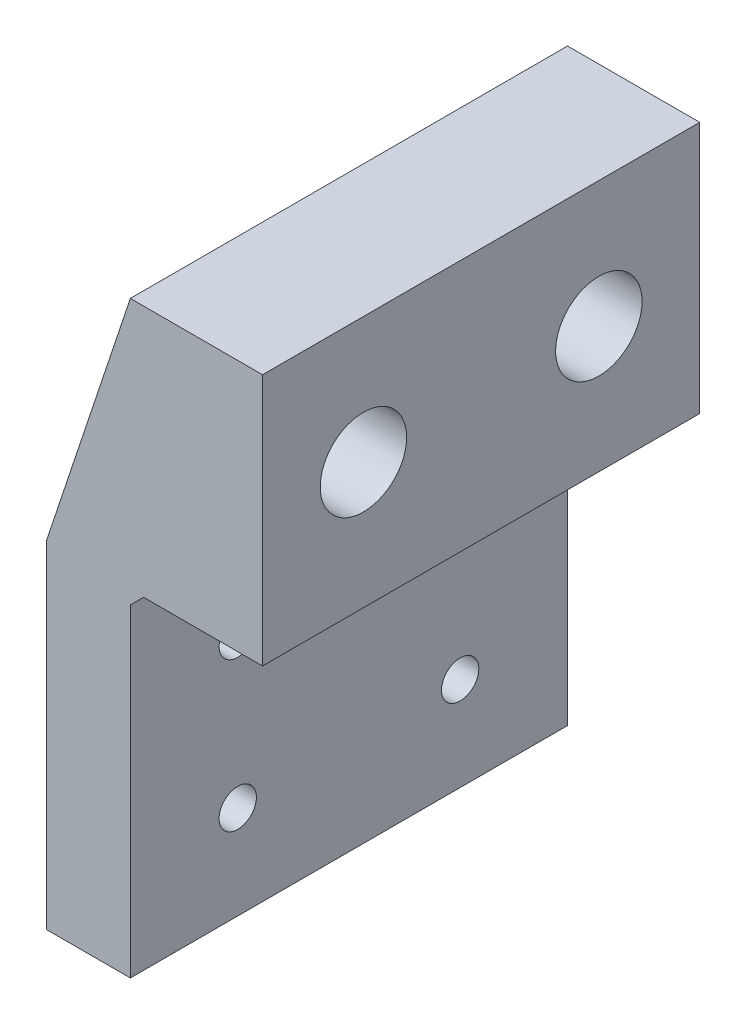
ISO-10303-21;
HEADER;
FILE_DESCRIPTION(('STEP AP214'),'2;1');
FILE_NAME('part.step','',(''),(''),'','','');
FILE_SCHEMA(('AUTOMOTIVE_DESIGN { 1 0 10303 214 1 1 1 1 }'));
ENDSEC;
DATA;
#1=APPLICATION_CONTEXT('core data for automotive mechanical design processes');
#2=APPLICATION_PROTOCOL_DEFINITION('international standard','automotive_design',2000,#1);
#3=PRODUCT_CONTEXT('',#1,'mechanical');
#4=PRODUCT('Part','Part','',(#3));
#5=PRODUCT_RELATED_PRODUCT_CATEGORY('part','',(#4));
#6=PRODUCT_DEFINITION_FORMATION('','',#4);
#7=PRODUCT_DEFINITION_CONTEXT('part definition',#1,'design');
#8=PRODUCT_DEFINITION('design','',#6,#7);
#9=PRODUCT_DEFINITION_SHAPE('','',#8);
#10=(LENGTH_UNIT() NAMED_UNIT(*) SI_UNIT(.MILLI.,.METRE.));
#11=(NAMED_UNIT(*) PLANE_ANGLE_UNIT() SI_UNIT($,.RADIAN.));
#12=(NAMED_UNIT(*) SI_UNIT($,.STERADIAN.) SOLID_ANGLE_UNIT());
#13=UNCERTAINTY_MEASURE_WITH_UNIT(LENGTH_MEASURE(1.E-05),#10,'distance_accuracy_value','');
#14=(GEOMETRIC_REPRESENTATION_CONTEXT(3) GLOBAL_UNCERTAINTY_ASSIGNED_CONTEXT((#13)) GLOBAL_UNIT_ASSIGNED_CONTEXT((#10,
#11,#12)) REPRESENTATION_CONTEXT('',''));
#15=CARTESIAN_POINT('',(0.,0.,0.));
#16=DIRECTION('',(0.,0.,1.));
#17=DIRECTION('',(1.,0.,0.));
#18=AXIS2_PLACEMENT_3D('',#15,#16,#17);
#19=CARTESIAN_POINT('',(16.333600048,9.525,-25.4));
#20=DIRECTION('',(1.,0.,0.));
#21=DIRECTION('',(0.,0.,-1.));
#22=AXIS2_PLACEMENT_3D('',#19,#20,#21);
#23=CYLINDRICAL_SURFACE('',#22,3.26389999999999);
#24=CARTESIAN_POINT('',(16.333600048,9.525,-25.4));
#25=DIRECTION('',(1.,0.,0.));
#26=DIRECTION('',(0.,0.,-1.));
#27=AXIS2_PLACEMENT_3D('',#24,#25,#26);
#28=CIRCLE('',#27,3.26389999999999);
#29=CARTESIAN_POINT('',(16.333600048,9.525,-28.6639));
#30=VERTEX_POINT('',#29);
#31=EDGE_CURVE('E173',#30,#30,#28,.T.);
#32=ORIENTED_EDGE('',*,*,#31,.T.);
#33=EDGE_LOOP('',(#32));
#34=FACE_BOUND('',#33,.T.);
#35=CARTESIAN_POINT('',(7.62,9.525,-25.4));
#36=DIRECTION('',(-1.,0.,0.));
#37=DIRECTION('',(0.,0.,1.));
#38=AXIS2_PLACEMENT_3D('',#35,#36,#37);
#39=CIRCLE('',#38,3.26389999999999);
#40=CARTESIAN_POINT('',(7.62,9.525,-22.1361));
#41=VERTEX_POINT('',#40);
#42=EDGE_CURVE('E167',#41,#41,#39,.F.);
#43=ORIENTED_EDGE('',*,*,#42,.F.);
#44=EDGE_LOOP('',(#43));
#45=FACE_BOUND('',#44,.T.);
#46=ADVANCED_FACE('F41',(#34,#45),#23,.F.);
#47=CARTESIAN_POINT('',(16.333600048,9.525,-7.62));
#48=DIRECTION('',(1.,0.,0.));
#49=DIRECTION('',(0.,0.,-1.));
#50=AXIS2_PLACEMENT_3D('',#47,#48,#49);
#51=CYLINDRICAL_SURFACE('',#50,3.26389999999999);
#52=CARTESIAN_POINT('',(16.333600048,9.525,-7.62));
#53=DIRECTION('',(1.,0.,0.));
#54=DIRECTION('',(0.,0.,-1.));
#55=AXIS2_PLACEMENT_3D('',#52,#53,#54);
#56=CIRCLE('',#55,3.26389999999999);
#57=CARTESIAN_POINT('',(16.333600048,9.525,-10.8839));
#58=VERTEX_POINT('',#57);
#59=EDGE_CURVE('E170',#58,#58,#56,.T.);
#60=ORIENTED_EDGE('',*,*,#59,.T.);
#61=EDGE_LOOP('',(#60));
#62=FACE_BOUND('',#61,.T.);
#63=CARTESIAN_POINT('',(7.62,9.525,-7.62));
#64=DIRECTION('',(-1.,0.,0.));
#65=DIRECTION('',(0.,0.,1.));
#66=AXIS2_PLACEMENT_3D('',#63,#64,#65);
#67=CIRCLE('',#66,3.26389999999999);
#68=CARTESIAN_POINT('',(7.62,9.525,-4.35610000000001));
#69=VERTEX_POINT('',#68);
#70=EDGE_CURVE('E162',#69,#69,#67,.F.);
#71=ORIENTED_EDGE('',*,*,#70,.F.);
#72=EDGE_LOOP('',(#71));
#73=FACE_BOUND('',#72,.T.);
#74=ADVANCED_FACE('F290',(#62,#73),#51,.F.);
#75=CARTESIAN_POINT('',(16.333600048,0.,0.));
#76=DIRECTION('',(-1.,0.,0.));
#77=DIRECTION('',(0.,0.,1.));
#78=AXIS2_PLACEMENT_3D('',#75,#76,#77);
#79=PLANE('',#78);
#80=ORIENTED_EDGE('',*,*,#31,.F.);
#81=EDGE_LOOP('',(#80));
#82=FACE_BOUND('',#81,.T.);
#83=DIRECTION('',(0.,-1.,0.));
#84=VECTOR('',#83,1.);
#85=CARTESIAN_POINT('',(16.333600048,0.,0.));
#86=LINE('',#85,#84);
#87=CARTESIAN_POINT('',(16.333600048,19.05,0.));
#88=VERTEX_POINT('',#87);
#89=CARTESIAN_POINT('',(16.333600048,0.,0.));
#90=VERTEX_POINT('',#89);
#91=EDGE_CURVE('E176',#88,#90,#86,.T.);
#92=ORIENTED_EDGE('',*,*,#91,.T.);
#93=DIRECTION('',(0.,0.,-1.));
#94=VECTOR('',#93,1.);
#95=CARTESIAN_POINT('',(16.333600048,0.,0.));
#96=LINE('',#95,#94);
#97=CARTESIAN_POINT('',(16.333600048,0.,-33.02));
#98=VERTEX_POINT('',#97);
#99=EDGE_CURVE('E179',#90,#98,#96,.T.);
#100=ORIENTED_EDGE('',*,*,#99,.T.);
#101=DIRECTION('',(0.,1.,0.));
#102=VECTOR('',#101,1.);
#103=CARTESIAN_POINT('',(16.333600048,0.,-33.02));
#104=LINE('',#103,#102);
#105=CARTESIAN_POINT('',(16.333600048,19.05,-33.02));
#106=VERTEX_POINT('',#105);
#107=EDGE_CURVE('E181',#98,#106,#104,.T.);
#108=ORIENTED_EDGE('',*,*,#107,.T.);
#109=DIRECTION('',(0.,0.,1.));
#110=VECTOR('',#109,1.);
#111=CARTESIAN_POINT('',(16.333600048,19.05,0.));
#112=LINE('',#111,#110);
#113=EDGE_CURVE('E183',#106,#88,#112,.T.);
#114=ORIENTED_EDGE('',*,*,#113,.T.);
#115=EDGE_LOOP('',(#92,#100,#108,#114));
#116=FACE_BOUND('',#115,.T.);
#117=ORIENTED_EDGE('',*,*,#59,.F.);
#118=EDGE_LOOP('',(#117));
#119=FACE_BOUND('',#118,.T.);
#120=ADVANCED_FACE('F275',(#82,#116,#119),#79,.F.);
#121=CARTESIAN_POINT('',(6.35,0.,0.));
#122=DIRECTION('',(1.,0.,0.));
#123=DIRECTION('',(0.,0.,-1.));
#124=AXIS2_PLACEMENT_3D('',#121,#122,#123);
#125=PLANE('',#124);
#126=DIRECTION('',(0.,1.,0.));
#127=VECTOR('',#126,1.);
#128=CARTESIAN_POINT('',(6.35,0.,-33.02));
#129=LINE('',#128,#127);
#130=CARTESIAN_POINT('',(6.35,-25.4,-33.02));
#131=VERTEX_POINT('',#130);
#132=CARTESIAN_POINT('',(6.35,-0.999999999999994,-33.02));
#133=VERTEX_POINT('',#132);
#134=EDGE_CURVE('E234',#131,#133,#129,.T.);
#135=ORIENTED_EDGE('',*,*,#134,.T.);
#136=DIRECTION('',(0.,0.,1.));
#137=VECTOR('',#136,1.);
#138=CARTESIAN_POINT('',(6.35,-0.999999999999994,0.));
#139=LINE('',#138,#137);
#140=CARTESIAN_POINT('',(6.35,-0.999999999999994,0.));
#141=VERTEX_POINT('',#140);
#142=EDGE_CURVE('E63',#133,#141,#139,.T.);
#143=ORIENTED_EDGE('',*,*,#142,.T.);
#144=DIRECTION('',(0.,-1.,0.));
#145=VECTOR('',#144,1.);
#146=CARTESIAN_POINT('',(6.35,0.,0.));
#147=LINE('',#146,#145);
#148=CARTESIAN_POINT('',(6.35,-25.4,0.));
#149=VERTEX_POINT('',#148);
#150=EDGE_CURVE('E229',#141,#149,#147,.T.);
#151=ORIENTED_EDGE('',*,*,#150,.T.);
#152=DIRECTION('',(0.,0.,-1.));
#153=VECTOR('',#152,1.);
#154=CARTESIAN_POINT('',(6.35,-25.4,0.));
#155=LINE('',#154,#153);
#156=EDGE_CURVE('E231',#149,#131,#155,.T.);
#157=ORIENTED_EDGE('',*,*,#156,.T.);
#158=EDGE_LOOP('',(#135,#143,#151,#157));
#159=FACE_BOUND('',#158,.T.);
#160=CARTESIAN_POINT('',(6.35,-18.3261,-24.9089834759928));
#161=DIRECTION('',(1.,0.,0.));
#162=DIRECTION('',(0.,0.,-1.));
#163=AXIS2_PLACEMENT_3D('',#160,#161,#162);
#164=CIRCLE('',#163,1.4097);
#165=CARTESIAN_POINT('',(6.35,-18.3261,-26.3186834759928));
#166=VERTEX_POINT('',#165);
#167=EDGE_CURVE('E211',#166,#166,#164,.T.);
#168=ORIENTED_EDGE('',*,*,#167,.F.);
#169=EDGE_LOOP('',(#168));
#170=FACE_BOUND('',#169,.T.);
#171=CARTESIAN_POINT('',(6.35,-7.0739,-8.11101652400721));
#172=DIRECTION('',(1.,0.,0.));
#173=DIRECTION('',(0.,0.,-1.));
#174=AXIS2_PLACEMENT_3D('',#171,#172,#173);
#175=CIRCLE('',#174,1.4097);
#176=CARTESIAN_POINT('',(6.35,-7.0739,-9.52071652400721));
#177=VERTEX_POINT('',#176);
#178=EDGE_CURVE('E223',#177,#177,#175,.T.);
#179=ORIENTED_EDGE('',*,*,#178,.F.);
#180=EDGE_LOOP('',(#179));
#181=FACE_BOUND('',#180,.T.);
#182=CARTESIAN_POINT('',(6.35,-18.3261,-8.11101652400721));
#183=DIRECTION('',(1.,0.,0.));
#184=DIRECTION('',(0.,0.,-1.));
#185=AXIS2_PLACEMENT_3D('',#182,#183,#184);
#186=CIRCLE('',#185,1.4097);
#187=CARTESIAN_POINT('',(6.35,-18.3261,-9.52071652400721));
#188=VERTEX_POINT('',#187);
#189=EDGE_CURVE('E217',#188,#188,#186,.T.);
#190=ORIENTED_EDGE('',*,*,#189,.F.);
#191=EDGE_LOOP('',(#190));
#192=FACE_BOUND('',#191,.T.);
#193=CARTESIAN_POINT('',(6.35,-7.07389999999999,-24.9089834759928));
#194=DIRECTION('',(1.,0.,0.));
#195=DIRECTION('',(0.,0.,-1.));
#196=AXIS2_PLACEMENT_3D('',#193,#194,#195);
#197=CIRCLE('',#196,1.4097);
#198=CARTESIAN_POINT('',(6.35,-7.07389999999999,-26.3186834759928));
#199=VERTEX_POINT('',#198);
#200=EDGE_CURVE('E205',#199,#199,#197,.T.);
#201=ORIENTED_EDGE('',*,*,#200,.F.);
#202=EDGE_LOOP('',(#201));
#203=FACE_BOUND('',#202,.T.);
#204=ADVANCED_FACE('F303',(#159,#170,#181,#192,#203),#125,.T.);
#205=CARTESIAN_POINT('',(0.,0.,0.));
#206=DIRECTION('',(1.,0.,0.));
#207=DIRECTION('',(0.,0.,-1.));
#208=AXIS2_PLACEMENT_3D('',#205,#206,#207);
#209=PLANE('',#208);
#210=DIRECTION('',(0.,-1.,0.));
#211=VECTOR('',#210,1.);
#212=CARTESIAN_POINT('',(0.,0.,0.));
#213=LINE('',#212,#211);
#214=CARTESIAN_POINT('',(0.,0.,0.));
#215=VERTEX_POINT('',#214);
#216=CARTESIAN_POINT('',(0.,-25.4,0.));
#217=VERTEX_POINT('',#216);
#218=EDGE_CURVE('E226',#215,#217,#213,.T.);
#219=ORIENTED_EDGE('',*,*,#218,.F.);
#220=DIRECTION('',(0.,0.,1.));
#221=VECTOR('',#220,1.);
#222=CARTESIAN_POINT('',(0.,0.,0.));
#223=LINE('',#222,#221);
#224=CARTESIAN_POINT('',(0.,0.,-33.02));
#225=VERTEX_POINT('',#224);
#226=EDGE_CURVE('E232',#225,#215,#223,.T.);
#227=ORIENTED_EDGE('',*,*,#226,.F.);
#228=DIRECTION('',(0.,1.,0.));
#229=VECTOR('',#228,1.);
#230=CARTESIAN_POINT('',(0.,0.,-33.02));
#231=LINE('',#230,#229);
#232=CARTESIAN_POINT('',(0.,-25.4,-33.02));
#233=VERTEX_POINT('',#232);
#234=EDGE_CURVE('E241',#233,#225,#231,.T.);
#235=ORIENTED_EDGE('',*,*,#234,.F.);
#236=DIRECTION('',(0.,0.,-1.));
#237=VECTOR('',#236,1.);
#238=CARTESIAN_POINT('',(0.,-25.4,0.));
#239=LINE('',#238,#237);
#240=EDGE_CURVE('E239',#217,#233,#239,.T.);
#241=ORIENTED_EDGE('',*,*,#240,.F.);
#242=EDGE_LOOP('',(#219,#227,#235,#241));
#243=FACE_BOUND('',#242,.T.);
#244=CARTESIAN_POINT('',(0.,-7.0739,-8.11101652400721));
#245=DIRECTION('',(1.,0.,0.));
#246=DIRECTION('',(0.,0.,-1.));
#247=AXIS2_PLACEMENT_3D('',#244,#245,#246);
#248=CIRCLE('',#247,1.4097);
#249=CARTESIAN_POINT('',(0.,-7.0739,-9.52071652400721));
#250=VERTEX_POINT('',#249);
#251=EDGE_CURVE('E220',#250,#250,#248,.T.);
#252=ORIENTED_EDGE('',*,*,#251,.T.);
#253=EDGE_LOOP('',(#252));
#254=FACE_BOUND('',#253,.T.);
#255=CARTESIAN_POINT('',(0.,-18.3261,-8.11101652400721));
#256=DIRECTION('',(1.,0.,0.));
#257=DIRECTION('',(0.,0.,-1.));
#258=AXIS2_PLACEMENT_3D('',#255,#256,#257);
#259=CIRCLE('',#258,1.4097);
#260=CARTESIAN_POINT('',(0.,-18.3261,-9.52071652400721));
#261=VERTEX_POINT('',#260);
#262=EDGE_CURVE('E214',#261,#261,#259,.T.);
#263=ORIENTED_EDGE('',*,*,#262,.T.);
#264=EDGE_LOOP('',(#263));
#265=FACE_BOUND('',#264,.T.);
#266=CARTESIAN_POINT('',(0.,-18.3261,-24.9089834759928));
#267=DIRECTION('',(1.,0.,0.));
#268=DIRECTION('',(0.,0.,-1.));
#269=AXIS2_PLACEMENT_3D('',#266,#267,#268);
#270=CIRCLE('',#269,1.4097);
#271=CARTESIAN_POINT('',(0.,-18.3261,-26.3186834759928));
#272=VERTEX_POINT('',#271);
#273=EDGE_CURVE('E208',#272,#272,#270,.T.);
#274=ORIENTED_EDGE('',*,*,#273,.T.);
#275=EDGE_LOOP('',(#274));
#276=FACE_BOUND('',#275,.T.);
#277=CARTESIAN_POINT('',(0.,-7.07389999999999,-24.9089834759928));
#278=DIRECTION('',(1.,0.,0.));
#279=DIRECTION('',(0.,0.,-1.));
#280=AXIS2_PLACEMENT_3D('',#277,#278,#279);
#281=CIRCLE('',#280,1.4097);
#282=CARTESIAN_POINT('',(0.,-7.07389999999999,-26.3186834759928));
#283=VERTEX_POINT('',#282);
#284=EDGE_CURVE('E204',#283,#283,#281,.T.);
#285=ORIENTED_EDGE('',*,*,#284,.T.);
#286=EDGE_LOOP('',(#285));
#287=FACE_BOUND('',#286,.T.);
#288=ADVANCED_FACE('F332',(#243,#254,#265,#276,#287),#209,.F.);
#289=CARTESIAN_POINT('',(6.35,0.,0.));
#290=DIRECTION('',(0.,0.,-1.));
#291=DIRECTION('',(0.,1.,0.));
#292=AXIS2_PLACEMENT_3D('',#289,#290,#291);
#293=PLANE('',#292);
#294=ORIENTED_EDGE('',*,*,#218,.T.);
#295=DIRECTION('',(-1.,0.,0.));
#296=VECTOR('',#295,1.);
#297=CARTESIAN_POINT('',(6.35,-25.4,0.));
#298=LINE('',#297,#296);
#299=EDGE_CURVE('E248',#149,#217,#298,.T.);
#300=ORIENTED_EDGE('',*,*,#299,.F.);
#301=ORIENTED_EDGE('',*,*,#150,.F.);
#302=DIRECTION('',(0.70710678118655,0.707106781186545,0.));
#303=VECTOR('',#302,1.);
#304=CARTESIAN_POINT('',(6.85,-0.5,0.));
#305=LINE('',#304,#303);
#306=CARTESIAN_POINT('',(7.35,0.,0.));
#307=VERTEX_POINT('',#306);
#308=EDGE_CURVE('E11',#141,#307,#305,.T.);
#309=ORIENTED_EDGE('',*,*,#308,.T.);
#310=DIRECTION('',(-1.,0.,0.));
#311=VECTOR('',#310,1.);
#312=CARTESIAN_POINT('',(16.333600048,0.,0.));
#313=LINE('',#312,#311);
#314=EDGE_CURVE('E193',#90,#307,#313,.T.);
#315=ORIENTED_EDGE('',*,*,#314,.F.);
#316=ORIENTED_EDGE('',*,*,#91,.F.);
#317=DIRECTION('',(-1.,0.,0.));
#318=VECTOR('',#317,1.);
#319=CARTESIAN_POINT('',(16.333600048,19.05,0.));
#320=LINE('',#319,#318);
#321=CARTESIAN_POINT('',(6.35,19.05,0.));
#322=VERTEX_POINT('',#321);
#323=EDGE_CURVE('E185',#88,#322,#320,.T.);
#324=ORIENTED_EDGE('',*,*,#323,.T.);
#325=DIRECTION('',(-0.316227766016838,-0.948683298050514,0.));
#326=VECTOR('',#325,1.);
#327=CARTESIAN_POINT('',(6.35,19.05,0.));
#328=LINE('',#327,#326);
#329=EDGE_CURVE('E196',#322,#215,#328,.T.);
#330=ORIENTED_EDGE('',*,*,#329,.T.);
#331=EDGE_LOOP('',(#294,#300,#301,#309,#315,#316,#324,#330));
#332=FACE_BOUND('',#331,.T.);
#333=ADVANCED_FACE('F280',(#332),#293,.F.);
#334=CARTESIAN_POINT('',(6.35,-25.4,0.));
#335=DIRECTION('',(0.,1.,0.));
#336=DIRECTION('',(0.,0.,1.));
#337=AXIS2_PLACEMENT_3D('',#334,#335,#336);
#338=PLANE('',#337);
#339=ORIENTED_EDGE('',*,*,#240,.T.);
#340=DIRECTION('',(-1.,0.,0.));
#341=VECTOR('',#340,1.);
#342=CARTESIAN_POINT('',(6.35,-25.4,-33.02));
#343=LINE('',#342,#341);
#344=EDGE_CURVE('E236',#131,#233,#343,.T.);
#345=ORIENTED_EDGE('',*,*,#344,.F.);
#346=ORIENTED_EDGE('',*,*,#156,.F.);
#347=ORIENTED_EDGE('',*,*,#299,.T.);
#348=EDGE_LOOP('',(#339,#345,#346,#347));
#349=FACE_BOUND('',#348,.T.);
#350=ADVANCED_FACE('F338',(#349),#338,.F.);
#351=CARTESIAN_POINT('',(6.35,0.,-33.02));
#352=DIRECTION('',(0.,0.,1.));
#353=DIRECTION('',(1.,0.,0.));
#354=AXIS2_PLACEMENT_3D('',#351,#352,#353);
#355=PLANE('',#354);
#356=ORIENTED_EDGE('',*,*,#234,.T.);
#357=DIRECTION('',(0.316227766016838,0.948683298050514,0.));
#358=VECTOR('',#357,1.);
#359=CARTESIAN_POINT('',(6.35,19.05,-33.02));
#360=LINE('',#359,#358);
#361=CARTESIAN_POINT('',(6.35,19.05,-33.02));
#362=VERTEX_POINT('',#361);
#363=EDGE_CURVE('E202',#225,#362,#360,.T.);
#364=ORIENTED_EDGE('',*,*,#363,.T.);
#365=DIRECTION('',(-1.,0.,0.));
#366=VECTOR('',#365,1.);
#367=CARTESIAN_POINT('',(16.333600048,19.05,-33.02));
#368=LINE('',#367,#366);
#369=EDGE_CURVE('E188',#106,#362,#368,.T.);
#370=ORIENTED_EDGE('',*,*,#369,.F.);
#371=ORIENTED_EDGE('',*,*,#107,.F.);
#372=DIRECTION('',(-1.,0.,0.));
#373=VECTOR('',#372,1.);
#374=CARTESIAN_POINT('',(16.333600048,0.,-33.02));
#375=LINE('',#374,#373);
#376=CARTESIAN_POINT('',(7.35,0.,-33.02));
#377=VERTEX_POINT('',#376);
#378=EDGE_CURVE('E191',#98,#377,#375,.T.);
#379=ORIENTED_EDGE('',*,*,#378,.T.);
#380=DIRECTION('',(-0.70710678118655,-0.707106781186545,0.));
#381=VECTOR('',#380,1.);
#382=CARTESIAN_POINT('',(6.85,-0.5,-33.02));
#383=LINE('',#382,#381);
#384=EDGE_CURVE('E50',#377,#133,#383,.T.);
#385=ORIENTED_EDGE('',*,*,#384,.T.);
#386=ORIENTED_EDGE('',*,*,#134,.F.);
#387=ORIENTED_EDGE('',*,*,#344,.T.);
#388=EDGE_LOOP('',(#356,#364,#370,#371,#379,#385,#386,#387));
#389=FACE_BOUND('',#388,.T.);
#390=ADVANCED_FACE('F271',(#389),#355,.F.);
#391=CARTESIAN_POINT('',(6.35,-7.0739,-8.11101652400721));
#392=DIRECTION('',(-1.,0.,0.));
#393=DIRECTION('',(0.,0.,1.));
#394=AXIS2_PLACEMENT_3D('',#391,#392,#393);
#395=CYLINDRICAL_SURFACE('',#394,1.4097);
#396=ORIENTED_EDGE('',*,*,#178,.T.);
#397=EDGE_LOOP('',(#396));
#398=FACE_BOUND('',#397,.T.);
#399=ORIENTED_EDGE('',*,*,#251,.F.);
#400=EDGE_LOOP('',(#399));
#401=FACE_BOUND('',#400,.T.);
#402=ADVANCED_FACE('F325',(#398,#401),#395,.F.);
#403=CARTESIAN_POINT('',(6.35,-18.3261,-8.11101652400721));
#404=DIRECTION('',(-1.,0.,0.));
#405=DIRECTION('',(0.,0.,1.));
#406=AXIS2_PLACEMENT_3D('',#403,#404,#405);
#407=CYLINDRICAL_SURFACE('',#406,1.4097);
#408=ORIENTED_EDGE('',*,*,#189,.T.);
#409=EDGE_LOOP('',(#408));
#410=FACE_BOUND('',#409,.T.);
#411=ORIENTED_EDGE('',*,*,#262,.F.);
#412=EDGE_LOOP('',(#411));
#413=FACE_BOUND('',#412,.T.);
#414=ADVANCED_FACE('F321',(#410,#413),#407,.F.);
#415=CARTESIAN_POINT('',(6.35,-18.3261,-24.9089834759928));
#416=DIRECTION('',(-1.,0.,0.));
#417=DIRECTION('',(0.,0.,1.));
#418=AXIS2_PLACEMENT_3D('',#415,#416,#417);
#419=CYLINDRICAL_SURFACE('',#418,1.4097);
#420=ORIENTED_EDGE('',*,*,#167,.T.);
#421=EDGE_LOOP('',(#420));
#422=FACE_BOUND('',#421,.T.);
#423=ORIENTED_EDGE('',*,*,#273,.F.);
#424=EDGE_LOOP('',(#423));
#425=FACE_BOUND('',#424,.T.);
#426=ADVANCED_FACE('F317',(#422,#425),#419,.F.);
#427=CARTESIAN_POINT('',(6.35,-7.07389999999999,-24.9089834759928));
#428=DIRECTION('',(-1.,0.,0.));
#429=DIRECTION('',(0.,0.,1.));
#430=AXIS2_PLACEMENT_3D('',#427,#428,#429);
#431=CYLINDRICAL_SURFACE('',#430,1.4097);
#432=ORIENTED_EDGE('',*,*,#200,.T.);
#433=EDGE_LOOP('',(#432));
#434=FACE_BOUND('',#433,.T.);
#435=ORIENTED_EDGE('',*,*,#284,.F.);
#436=EDGE_LOOP('',(#435));
#437=FACE_BOUND('',#436,.T.);
#438=ADVANCED_FACE('F313',(#434,#437),#431,.F.);
#439=CARTESIAN_POINT('',(6.35,19.05,-53.1004631420692));
#440=DIRECTION('',(-0.948683298050514,0.316227766016838,0.));
#441=DIRECTION('',(-0.316227766016838,-0.948683298050514,0.));
#442=AXIS2_PLACEMENT_3D('',#439,#440,#441);
#443=PLANE('',#442);
#444=CARTESIAN_POINT('',(3.175,9.525,-25.4));
#445=DIRECTION('',(-0.948683298050514,0.316227766016838,0.));
#446=DIRECTION('',(-0.316227766016838,-0.948683298050514,0.));
#447=AXIS2_PLACEMENT_3D('',#444,#445,#446);
#448=ELLIPSE('',#447,5.8902691883403,5.588);
#449=CARTESIAN_POINT('',(5.03766666666667,15.113,-25.4));
#450=VERTEX_POINT('',#449);
#451=CARTESIAN_POINT('',(1.31233333333333,3.937,-25.4));
#452=VERTEX_POINT('',#451);
#453=EDGE_CURVE('E138',#450,#452,#448,.T.);
#454=ORIENTED_EDGE('',*,*,#453,.F.);
#455=DIRECTION('',(0.,0.,-1.));
#456=VECTOR('',#455,1.);
#457=CARTESIAN_POINT('',(5.03766666666667,15.113,-53.1004631420692));
#458=LINE('',#457,#456);
#459=CARTESIAN_POINT('',(5.03766666666667,15.113,-7.62));
#460=VERTEX_POINT('',#459);
#461=EDGE_CURVE('E257',#460,#450,#458,.T.);
#462=ORIENTED_EDGE('',*,*,#461,.F.);
#463=CARTESIAN_POINT('',(3.175,9.525,-7.62));
#464=DIRECTION('',(-0.948683298050514,0.316227766016838,0.));
#465=DIRECTION('',(-0.316227766016838,-0.948683298050514,0.));
#466=AXIS2_PLACEMENT_3D('',#463,#464,#465);
#467=ELLIPSE('',#466,5.8902691883403,5.588);
#468=CARTESIAN_POINT('',(1.31233333333333,3.937,-7.62));
#469=VERTEX_POINT('',#468);
#470=EDGE_CURVE('E255',#469,#460,#467,.T.);
#471=ORIENTED_EDGE('',*,*,#470,.F.);
#472=DIRECTION('',(0.,0.,1.));
#473=VECTOR('',#472,1.);
#474=CARTESIAN_POINT('',(1.31233333333333,3.93699999999999,-53.1004631420692));
#475=LINE('',#474,#473);
#476=EDGE_CURVE('E251',#452,#469,#475,.T.);
#477=ORIENTED_EDGE('',*,*,#476,.F.);
#478=EDGE_LOOP('',(#454,#462,#471,#477));
#479=FACE_BOUND('',#478,.T.);
#480=ORIENTED_EDGE('',*,*,#363,.F.);
#481=ORIENTED_EDGE('',*,*,#226,.T.);
#482=ORIENTED_EDGE('',*,*,#329,.F.);
#483=DIRECTION('',(0.,0.,1.));
#484=VECTOR('',#483,1.);
#485=CARTESIAN_POINT('',(6.35,19.05,-53.1004631420692));
#486=LINE('',#485,#484);
#487=EDGE_CURVE('E199',#362,#322,#486,.T.);
#488=ORIENTED_EDGE('',*,*,#487,.F.);
#489=EDGE_LOOP('',(#480,#481,#482,#488));
#490=FACE_BOUND('',#489,.T.);
#491=ADVANCED_FACE('F310',(#479,#490),#443,.T.);
#492=CARTESIAN_POINT('',(16.333600048,0.,0.));
#493=DIRECTION('',(0.,1.,0.));
#494=DIRECTION('',(0.,0.,1.));
#495=AXIS2_PLACEMENT_3D('',#492,#493,#494);
#496=PLANE('',#495);
#497=ORIENTED_EDGE('',*,*,#314,.T.);
#498=DIRECTION('',(0.,0.,-1.));
#499=VECTOR('',#498,1.);
#500=CARTESIAN_POINT('',(7.35,0.,0.));
#501=LINE('',#500,#499);
#502=EDGE_CURVE('E260',#307,#377,#501,.T.);
#503=ORIENTED_EDGE('',*,*,#502,.T.);
#504=ORIENTED_EDGE('',*,*,#378,.F.);
#505=ORIENTED_EDGE('',*,*,#99,.F.);
#506=EDGE_LOOP('',(#497,#503,#504,#505));
#507=FACE_BOUND('',#506,.T.);
#508=ADVANCED_FACE('F266',(#507),#496,.F.);
#509=CARTESIAN_POINT('',(16.333600048,19.05,0.));
#510=DIRECTION('',(0.,-1.,0.));
#511=DIRECTION('',(0.,0.,-1.));
#512=AXIS2_PLACEMENT_3D('',#509,#510,#511);
#513=PLANE('',#512);
#514=ORIENTED_EDGE('',*,*,#487,.T.);
#515=ORIENTED_EDGE('',*,*,#323,.F.);
#516=ORIENTED_EDGE('',*,*,#113,.F.);
#517=ORIENTED_EDGE('',*,*,#369,.T.);
#518=EDGE_LOOP('',(#514,#515,#516,#517));
#519=FACE_BOUND('',#518,.T.);
#520=ADVANCED_FACE('F305',(#519),#513,.F.);
#521=CARTESIAN_POINT('',(7.62,9.525,-25.4));
#522=DIRECTION('',(-1.,0.,0.));
#523=DIRECTION('',(0.,0.,1.));
#524=AXIS2_PLACEMENT_3D('',#521,#522,#523);
#525=PLANE('',#524);
#526=CARTESIAN_POINT('',(7.62,9.525,-25.4));
#527=DIRECTION('',(-1.,0.,0.));
#528=DIRECTION('',(0.,0.,1.));
#529=AXIS2_PLACEMENT_3D('',#526,#527,#528);
#530=CIRCLE('',#529,5.588);
#531=CARTESIAN_POINT('',(7.62,15.113,-25.4));
#532=VERTEX_POINT('',#531);
#533=CARTESIAN_POINT('',(7.62,3.937,-25.4));
#534=VERTEX_POINT('',#533);
#535=EDGE_CURVE('E135',#532,#534,#530,.T.);
#536=ORIENTED_EDGE('',*,*,#535,.T.);
#537=DIRECTION('',(0.,0.,1.));
#538=VECTOR('',#537,1.);
#539=CARTESIAN_POINT('',(7.62,3.937,-25.4));
#540=LINE('',#539,#538);
#541=CARTESIAN_POINT('',(7.62,3.937,-7.62));
#542=VERTEX_POINT('',#541);
#543=EDGE_CURVE('E145',#534,#542,#540,.T.);
#544=ORIENTED_EDGE('',*,*,#543,.T.);
#545=CARTESIAN_POINT('',(7.62,9.525,-7.62));
#546=DIRECTION('',(-1.,0.,0.));
#547=DIRECTION('',(0.,0.,1.));
#548=AXIS2_PLACEMENT_3D('',#545,#546,#547);
#549=CIRCLE('',#548,5.588);
#550=CARTESIAN_POINT('',(7.62,15.113,-7.62));
#551=VERTEX_POINT('',#550);
#552=EDGE_CURVE('E151',#542,#551,#549,.T.);
#553=ORIENTED_EDGE('',*,*,#552,.T.);
#554=DIRECTION('',(0.,0.,-1.));
#555=VECTOR('',#554,1.);
#556=CARTESIAN_POINT('',(7.62,15.113,-25.4));
#557=LINE('',#556,#555);
#558=EDGE_CURVE('E142',#551,#532,#557,.T.);
#559=ORIENTED_EDGE('',*,*,#558,.T.);
#560=EDGE_LOOP('',(#536,#544,#553,#559));
#561=FACE_BOUND('',#560,.T.);
#562=ORIENTED_EDGE('',*,*,#70,.T.);
#563=EDGE_LOOP('',(#562));
#564=FACE_BOUND('',#563,.T.);
#565=ORIENTED_EDGE('',*,*,#42,.T.);
#566=EDGE_LOOP('',(#565));
#567=FACE_BOUND('',#566,.T.);
#568=ADVANCED_FACE('F153',(#561,#564,#567),#525,.T.);
#569=CARTESIAN_POINT('',(7.62,9.525,-25.4));
#570=DIRECTION('',(-1.,0.,0.));
#571=DIRECTION('',(0.,0.,1.));
#572=AXIS2_PLACEMENT_3D('',#569,#570,#571);
#573=CYLINDRICAL_SURFACE('',#572,5.588);
#574=ORIENTED_EDGE('',*,*,#453,.T.);
#575=DIRECTION('',(-1.,0.,0.));
#576=VECTOR('',#575,1.);
#577=CARTESIAN_POINT('',(7.62,3.937,-25.4));
#578=LINE('',#577,#576);
#579=EDGE_CURVE('E130',#534,#452,#578,.T.);
#580=ORIENTED_EDGE('',*,*,#579,.F.);
#581=ORIENTED_EDGE('',*,*,#535,.F.);
#582=DIRECTION('',(-1.,0.,0.));
#583=VECTOR('',#582,1.);
#584=CARTESIAN_POINT('',(7.62,15.113,-25.4));
#585=LINE('',#584,#583);
#586=EDGE_CURVE('E160',#532,#450,#585,.T.);
#587=ORIENTED_EDGE('',*,*,#586,.T.);
#588=EDGE_LOOP('',(#574,#580,#581,#587));
#589=FACE_BOUND('',#588,.T.);
#590=ADVANCED_FACE('F132',(#589),#573,.F.);
#591=CARTESIAN_POINT('',(7.62,15.113,-25.4));
#592=DIRECTION('',(0.,1.,0.));
#593=DIRECTION('',(0.,0.,1.));
#594=AXIS2_PLACEMENT_3D('',#591,#592,#593);
#595=PLANE('',#594);
#596=ORIENTED_EDGE('',*,*,#461,.T.);
#597=ORIENTED_EDGE('',*,*,#586,.F.);
#598=ORIENTED_EDGE('',*,*,#558,.F.);
#599=DIRECTION('',(-1.,0.,0.));
#600=VECTOR('',#599,1.);
#601=CARTESIAN_POINT('',(7.62,15.113,-7.62));
#602=LINE('',#601,#600);
#603=EDGE_CURVE('E163',#551,#460,#602,.T.);
#604=ORIENTED_EDGE('',*,*,#603,.T.);
#605=EDGE_LOOP('',(#596,#597,#598,#604));
#606=FACE_BOUND('',#605,.T.);
#607=ADVANCED_FACE('F402',(#606),#595,.F.);
#608=CARTESIAN_POINT('',(7.62,9.525,-7.62));
#609=DIRECTION('',(-1.,0.,0.));
#610=DIRECTION('',(0.,0.,1.));
#611=AXIS2_PLACEMENT_3D('',#608,#609,#610);
#612=CYLINDRICAL_SURFACE('',#611,5.588);
#613=ORIENTED_EDGE('',*,*,#470,.T.);
#614=ORIENTED_EDGE('',*,*,#603,.F.);
#615=ORIENTED_EDGE('',*,*,#552,.F.);
#616=DIRECTION('',(-1.,0.,0.));
#617=VECTOR('',#616,1.);
#618=CARTESIAN_POINT('',(7.62,3.937,-7.62));
#619=LINE('',#618,#617);
#620=EDGE_CURVE('E141',#542,#469,#619,.T.);
#621=ORIENTED_EDGE('',*,*,#620,.T.);
#622=EDGE_LOOP('',(#613,#614,#615,#621));
#623=FACE_BOUND('',#622,.T.);
#624=ADVANCED_FACE('F287',(#623),#612,.F.);
#625=CARTESIAN_POINT('',(7.62,3.937,-25.4));
#626=DIRECTION('',(0.,-1.,0.));
#627=DIRECTION('',(0.,0.,-1.));
#628=AXIS2_PLACEMENT_3D('',#625,#626,#627);
#629=PLANE('',#628);
#630=ORIENTED_EDGE('',*,*,#476,.T.);
#631=ORIENTED_EDGE('',*,*,#620,.F.);
#632=ORIENTED_EDGE('',*,*,#543,.F.);
#633=ORIENTED_EDGE('',*,*,#579,.T.);
#634=EDGE_LOOP('',(#630,#631,#632,#633));
#635=FACE_BOUND('',#634,.T.);
#636=ADVANCED_FACE('F146',(#635),#629,.F.);
#637=CARTESIAN_POINT('',(7.35,0.,0.));
#638=DIRECTION('',(-0.707106781186545,0.70710678118655,0.));
#639=DIRECTION('',(0.,0.,-1.));
#640=AXIS2_PLACEMENT_3D('',#637,#638,#639);
#641=PLANE('',#640);
#642=ORIENTED_EDGE('',*,*,#308,.F.);
#643=ORIENTED_EDGE('',*,*,#142,.F.);
#644=ORIENTED_EDGE('',*,*,#384,.F.);
#645=ORIENTED_EDGE('',*,*,#502,.F.);
#646=EDGE_LOOP('',(#642,#643,#644,#645));
#647=FACE_BOUND('',#646,.T.);
#648=ADVANCED_FACE('F44',(#647),#641,.F.);
#649=CLOSED_SHELL('',(#46,#74,#120,#204,#288,#333,#350,#390,#402,#414,#426,#438,#491,#508,#520,
#568,#590,#607,#624,#636,#648));
#650=MANIFOLD_SOLID_BREP('B2',#649);
#651=ADVANCED_BREP_SHAPE_REPRESENTATION('',(#18,#650),#14);
#652=SHAPE_DEFINITION_REPRESENTATION(#9,#651);
ENDSEC;
END-ISO-10303-21;
